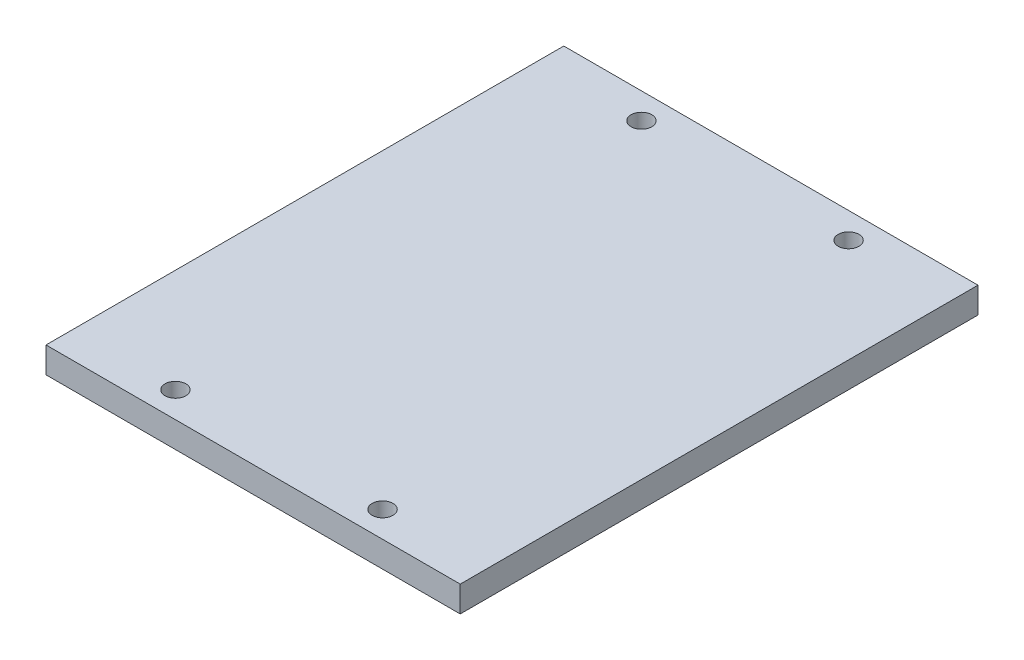
ISO-10303-21;
HEADER;
FILE_DESCRIPTION(('STEP AP214'),'2;1');
FILE_NAME('part.step','',(''),(''),'','','');
FILE_SCHEMA(('AUTOMOTIVE_DESIGN { 1 0 10303 214 1 1 1 1 }'));
ENDSEC;
DATA;
#1=APPLICATION_CONTEXT('core data for automotive mechanical design processes');
#2=APPLICATION_PROTOCOL_DEFINITION('international standard','automotive_design',2000,#1);
#3=PRODUCT_CONTEXT('',#1,'mechanical');
#4=PRODUCT('Part','Part','',(#3));
#5=PRODUCT_RELATED_PRODUCT_CATEGORY('part','',(#4));
#6=PRODUCT_DEFINITION_FORMATION('','',#4);
#7=PRODUCT_DEFINITION_CONTEXT('part definition',#1,'design');
#8=PRODUCT_DEFINITION('design','',#6,#7);
#9=PRODUCT_DEFINITION_SHAPE('','',#8);
#10=(LENGTH_UNIT() NAMED_UNIT(*) SI_UNIT(.MILLI.,.METRE.));
#11=(NAMED_UNIT(*) PLANE_ANGLE_UNIT() SI_UNIT($,.RADIAN.));
#12=(NAMED_UNIT(*) SI_UNIT($,.STERADIAN.) SOLID_ANGLE_UNIT());
#13=UNCERTAINTY_MEASURE_WITH_UNIT(LENGTH_MEASURE(1.E-05),#10,'distance_accuracy_value','');
#14=(GEOMETRIC_REPRESENTATION_CONTEXT(3) GLOBAL_UNCERTAINTY_ASSIGNED_CONTEXT((#13)) GLOBAL_UNIT_ASSIGNED_CONTEXT((#10,
#11,#12)) REPRESENTATION_CONTEXT('',''));
#15=CARTESIAN_POINT('',(0.,0.,0.));
#16=DIRECTION('',(0.,0.,1.));
#17=DIRECTION('',(1.,0.,0.));
#18=AXIS2_PLACEMENT_3D('',#15,#16,#17);
#19=CARTESIAN_POINT('',(50.8,6.35,63.5));
#20=DIRECTION('',(-1.,0.,0.));
#21=DIRECTION('',(0.,0.,1.));
#22=AXIS2_PLACEMENT_3D('',#19,#20,#21);
#23=PLANE('',#22);
#24=DIRECTION('',(0.,0.,-1.));
#25=VECTOR('',#24,1.);
#26=CARTESIAN_POINT('',(50.8,0.,63.5));
#27=LINE('',#26,#25);
#28=CARTESIAN_POINT('',(50.8,0.,63.5));
#29=VERTEX_POINT('',#28);
#30=CARTESIAN_POINT('',(50.8,0.,-63.5));
#31=VERTEX_POINT('',#30);
#32=EDGE_CURVE('E107',#29,#31,#27,.T.);
#33=ORIENTED_EDGE('',*,*,#32,.T.);
#34=DIRECTION('',(0.,-1.,0.));
#35=VECTOR('',#34,1.);
#36=CARTESIAN_POINT('',(50.8,6.35,-63.5));
#37=LINE('',#36,#35);
#38=CARTESIAN_POINT('',(50.8,6.35,-63.5));
#39=VERTEX_POINT('',#38);
#40=EDGE_CURVE('E11',#39,#31,#37,.T.);
#41=ORIENTED_EDGE('',*,*,#40,.F.);
#42=DIRECTION('',(0.,0.,-1.));
#43=VECTOR('',#42,1.);
#44=CARTESIAN_POINT('',(50.8,6.35,63.5));
#45=LINE('',#44,#43);
#46=CARTESIAN_POINT('',(50.8,6.35,63.5));
#47=VERTEX_POINT('',#46);
#48=EDGE_CURVE('E94',#47,#39,#45,.T.);
#49=ORIENTED_EDGE('',*,*,#48,.F.);
#50=DIRECTION('',(0.,-1.,0.));
#51=VECTOR('',#50,1.);
#52=CARTESIAN_POINT('',(50.8,6.35,63.5));
#53=LINE('',#52,#51);
#54=EDGE_CURVE('E103',#47,#29,#53,.T.);
#55=ORIENTED_EDGE('',*,*,#54,.T.);
#56=EDGE_LOOP('',(#33,#41,#49,#55));
#57=FACE_BOUND('',#56,.T.);
#58=ADVANCED_FACE('F41',(#57),#23,.F.);
#59=CARTESIAN_POINT('',(-50.8,6.35,-63.5));
#60=DIRECTION('',(0.,0.,1.));
#61=DIRECTION('',(1.,0.,0.));
#62=AXIS2_PLACEMENT_3D('',#59,#60,#61);
#63=PLANE('',#62);
#64=DIRECTION('',(-1.,0.,0.));
#65=VECTOR('',#64,1.);
#66=CARTESIAN_POINT('',(-50.8,0.,-63.5));
#67=LINE('',#66,#65);
#68=CARTESIAN_POINT('',(-50.8,0.,-63.5));
#69=VERTEX_POINT('',#68);
#70=EDGE_CURVE('E98',#31,#69,#67,.T.);
#71=ORIENTED_EDGE('',*,*,#70,.T.);
#72=DIRECTION('',(0.,-1.,0.));
#73=VECTOR('',#72,1.);
#74=CARTESIAN_POINT('',(-50.8,6.35,-63.5));
#75=LINE('',#74,#73);
#76=CARTESIAN_POINT('',(-50.8,6.35,-63.5));
#77=VERTEX_POINT('',#76);
#78=EDGE_CURVE('E50',#77,#69,#75,.T.);
#79=ORIENTED_EDGE('',*,*,#78,.F.);
#80=DIRECTION('',(-1.,0.,0.));
#81=VECTOR('',#80,1.);
#82=CARTESIAN_POINT('',(-50.8,6.35,-63.5));
#83=LINE('',#82,#81);
#84=EDGE_CURVE('E89',#39,#77,#83,.T.);
#85=ORIENTED_EDGE('',*,*,#84,.F.);
#86=ORIENTED_EDGE('',*,*,#40,.T.);
#87=EDGE_LOOP('',(#71,#79,#85,#86));
#88=FACE_BOUND('',#87,.T.);
#89=ADVANCED_FACE('F97',(#88),#63,.F.);
#90=CARTESIAN_POINT('',(-50.8,6.35,63.5));
#91=DIRECTION('',(1.,0.,0.));
#92=DIRECTION('',(0.,0.,-1.));
#93=AXIS2_PLACEMENT_3D('',#90,#91,#92);
#94=PLANE('',#93);
#95=DIRECTION('',(0.,0.,1.));
#96=VECTOR('',#95,1.);
#97=CARTESIAN_POINT('',(-50.8,0.,63.5));
#98=LINE('',#97,#96);
#99=CARTESIAN_POINT('',(-50.8,0.,63.5));
#100=VERTEX_POINT('',#99);
#101=EDGE_CURVE('E76',#69,#100,#98,.T.);
#102=ORIENTED_EDGE('',*,*,#101,.T.);
#103=DIRECTION('',(0.,-1.,0.));
#104=VECTOR('',#103,1.);
#105=CARTESIAN_POINT('',(-50.8,6.35,63.5));
#106=LINE('',#105,#104);
#107=CARTESIAN_POINT('',(-50.8,6.35,63.5));
#108=VERTEX_POINT('',#107);
#109=EDGE_CURVE('E99',#108,#100,#106,.T.);
#110=ORIENTED_EDGE('',*,*,#109,.F.);
#111=DIRECTION('',(0.,0.,1.));
#112=VECTOR('',#111,1.);
#113=CARTESIAN_POINT('',(-50.8,6.35,63.5));
#114=LINE('',#113,#112);
#115=EDGE_CURVE('E92',#77,#108,#114,.T.);
#116=ORIENTED_EDGE('',*,*,#115,.F.);
#117=ORIENTED_EDGE('',*,*,#78,.T.);
#118=EDGE_LOOP('',(#102,#110,#116,#117));
#119=FACE_BOUND('',#118,.T.);
#120=ADVANCED_FACE('F101',(#119),#94,.F.);
#121=CARTESIAN_POINT('',(-50.8,6.35,63.5));
#122=DIRECTION('',(0.,0.,-1.));
#123=DIRECTION('',(-1.,0.,0.));
#124=AXIS2_PLACEMENT_3D('',#121,#122,#123);
#125=PLANE('',#124);
#126=DIRECTION('',(1.,0.,0.));
#127=VECTOR('',#126,1.);
#128=CARTESIAN_POINT('',(-50.8,0.,63.5));
#129=LINE('',#128,#127);
#130=EDGE_CURVE('E82',#100,#29,#129,.T.);
#131=ORIENTED_EDGE('',*,*,#130,.T.);
#132=ORIENTED_EDGE('',*,*,#54,.F.);
#133=DIRECTION('',(1.,0.,0.));
#134=VECTOR('',#133,1.);
#135=CARTESIAN_POINT('',(-50.8,6.35,63.5));
#136=LINE('',#135,#134);
#137=EDGE_CURVE('E59',#108,#47,#136,.T.);
#138=ORIENTED_EDGE('',*,*,#137,.F.);
#139=ORIENTED_EDGE('',*,*,#109,.T.);
#140=EDGE_LOOP('',(#131,#132,#138,#139));
#141=FACE_BOUND('',#140,.T.);
#142=ADVANCED_FACE('F143',(#141),#125,.F.);
#143=CARTESIAN_POINT('',(0.,6.35,0.));
#144=DIRECTION('',(0.,-1.,0.));
#145=DIRECTION('',(0.,0.,-1.));
#146=AXIS2_PLACEMENT_3D('',#143,#144,#145);
#147=PLANE('',#146);
#148=CARTESIAN_POINT('',(25.4000000000001,6.35,-57.15));
#149=DIRECTION('',(0.,1.,0.));
#150=DIRECTION('',(0.,0.,-1.));
#151=AXIS2_PLACEMENT_3D('',#148,#149,#150);
#152=CIRCLE('',#151,2.55269999999999);
#153=CARTESIAN_POINT('',(25.4000000000001,6.35,-54.5973));
#154=VERTEX_POINT('',#153);
#155=EDGE_CURVE('E251',#154,#154,#152,.T.);
#156=ORIENTED_EDGE('',*,*,#155,.F.);
#157=EDGE_LOOP('',(#156));
#158=FACE_BOUND('',#157,.T.);
#159=CARTESIAN_POINT('',(25.4000000000001,6.35,57.15));
#160=DIRECTION('',(0.,1.,0.));
#161=DIRECTION('',(0.,0.,1.));
#162=AXIS2_PLACEMENT_3D('',#159,#160,#161);
#163=CIRCLE('',#162,2.55269999999999);
#164=CARTESIAN_POINT('',(25.4000000000001,6.35,59.7027));
#165=VERTEX_POINT('',#164);
#166=EDGE_CURVE('E248',#165,#165,#163,.T.);
#167=ORIENTED_EDGE('',*,*,#166,.F.);
#168=EDGE_LOOP('',(#167));
#169=FACE_BOUND('',#168,.T.);
#170=CARTESIAN_POINT('',(-25.4000000000001,6.35,57.15));
#171=DIRECTION('',(0.,1.,0.));
#172=DIRECTION('',(0.,0.,-1.));
#173=AXIS2_PLACEMENT_3D('',#170,#171,#172);
#174=CIRCLE('',#173,2.55269999999999);
#175=CARTESIAN_POINT('',(-25.4000000000001,6.35,59.7027));
#176=VERTEX_POINT('',#175);
#177=EDGE_CURVE('E250',#176,#176,#174,.T.);
#178=ORIENTED_EDGE('',*,*,#177,.F.);
#179=EDGE_LOOP('',(#178));
#180=FACE_BOUND('',#179,.T.);
#181=CARTESIAN_POINT('',(-25.4000000000001,6.35,-57.15));
#182=DIRECTION('',(0.,1.,0.));
#183=DIRECTION('',(0.,0.,1.));
#184=AXIS2_PLACEMENT_3D('',#181,#182,#183);
#185=CIRCLE('',#184,2.55269999999999);
#186=CARTESIAN_POINT('',(-25.4000000000001,6.35,-54.5973));
#187=VERTEX_POINT('',#186);
#188=EDGE_CURVE('E119',#187,#187,#185,.T.);
#189=ORIENTED_EDGE('',*,*,#188,.F.);
#190=EDGE_LOOP('',(#189));
#191=FACE_BOUND('',#190,.T.);
#192=ORIENTED_EDGE('',*,*,#48,.T.);
#193=ORIENTED_EDGE('',*,*,#84,.T.);
#194=ORIENTED_EDGE('',*,*,#115,.T.);
#195=ORIENTED_EDGE('',*,*,#137,.T.);
#196=EDGE_LOOP('',(#192,#193,#194,#195));
#197=FACE_BOUND('',#196,.T.);
#198=ADVANCED_FACE('F90',(#158,#169,#180,#191,#197),#147,.F.);
#199=CARTESIAN_POINT('',(0.,0.,0.));
#200=DIRECTION('',(0.,-1.,0.));
#201=DIRECTION('',(0.,0.,-1.));
#202=AXIS2_PLACEMENT_3D('',#199,#200,#201);
#203=PLANE('',#202);
#204=CARTESIAN_POINT('',(25.4000000000001,0.,-57.15));
#205=DIRECTION('',(0.,-1.,0.));
#206=DIRECTION('',(0.,0.,-1.));
#207=AXIS2_PLACEMENT_3D('',#204,#205,#206);
#208=CIRCLE('',#207,2.55269999999999);
#209=CARTESIAN_POINT('',(25.4000000000001,0.,-54.5973));
#210=VERTEX_POINT('',#209);
#211=EDGE_CURVE('E44',#210,#210,#208,.T.);
#212=ORIENTED_EDGE('',*,*,#211,.F.);
#213=EDGE_LOOP('',(#212));
#214=FACE_BOUND('',#213,.T.);
#215=CARTESIAN_POINT('',(25.4000000000001,0.,57.15));
#216=DIRECTION('',(0.,-1.,0.));
#217=DIRECTION('',(0.,0.,-1.));
#218=AXIS2_PLACEMENT_3D('',#215,#216,#217);
#219=CIRCLE('',#218,2.55269999999999);
#220=CARTESIAN_POINT('',(25.4000000000001,0.,59.7027));
#221=VERTEX_POINT('',#220);
#222=EDGE_CURVE('E121',#221,#221,#219,.T.);
#223=ORIENTED_EDGE('',*,*,#222,.F.);
#224=EDGE_LOOP('',(#223));
#225=FACE_BOUND('',#224,.T.);
#226=CARTESIAN_POINT('',(-25.4000000000001,0.,57.15));
#227=DIRECTION('',(0.,-1.,0.));
#228=DIRECTION('',(0.,0.,-1.));
#229=AXIS2_PLACEMENT_3D('',#226,#227,#228);
#230=CIRCLE('',#229,2.55269999999999);
#231=CARTESIAN_POINT('',(-25.4000000000001,0.,59.7027));
#232=VERTEX_POINT('',#231);
#233=EDGE_CURVE('E118',#232,#232,#230,.T.);
#234=ORIENTED_EDGE('',*,*,#233,.F.);
#235=EDGE_LOOP('',(#234));
#236=FACE_BOUND('',#235,.T.);
#237=CARTESIAN_POINT('',(-25.4000000000001,0.,-57.15));
#238=DIRECTION('',(0.,-1.,0.));
#239=DIRECTION('',(0.,0.,-1.));
#240=AXIS2_PLACEMENT_3D('',#237,#238,#239);
#241=CIRCLE('',#240,2.55269999999999);
#242=CARTESIAN_POINT('',(-25.4000000000001,0.,-54.5973));
#243=VERTEX_POINT('',#242);
#244=EDGE_CURVE('E115',#243,#243,#241,.T.);
#245=ORIENTED_EDGE('',*,*,#244,.F.);
#246=EDGE_LOOP('',(#245));
#247=FACE_BOUND('',#246,.T.);
#248=ORIENTED_EDGE('',*,*,#32,.F.);
#249=ORIENTED_EDGE('',*,*,#130,.F.);
#250=ORIENTED_EDGE('',*,*,#101,.F.);
#251=ORIENTED_EDGE('',*,*,#70,.F.);
#252=EDGE_LOOP('',(#248,#249,#250,#251));
#253=FACE_BOUND('',#252,.T.);
#254=ADVANCED_FACE('F131',(#214,#225,#236,#247,#253),#203,.T.);
#255=CARTESIAN_POINT('',(-25.4000000000001,-3.175,-57.15));
#256=DIRECTION('',(0.,1.,0.));
#257=DIRECTION('',(0.,0.,1.));
#258=AXIS2_PLACEMENT_3D('',#255,#256,#257);
#259=CYLINDRICAL_SURFACE('',#258,2.55269999999999);
#260=CARTESIAN_POINT('',(-25.4000000000001,0.,-54.5973));
#261=CARTESIAN_POINT('',(-25.4000000000001,0.0661458333333336,-54.5973));
#262=CARTESIAN_POINT('',(-25.4000000000001,0.132291666666667,-54.5973));
#263=CARTESIAN_POINT('',(-25.4000000000001,0.264583333333334,-54.5973));
#264=CARTESIAN_POINT('',(-25.4000000000001,0.330729166666667,-54.5973));
#265=CARTESIAN_POINT('',(-25.4000000000001,0.463020833333334,-54.5973));
#266=CARTESIAN_POINT('',(-25.4000000000001,0.529166666666667,-54.5973));
#267=CARTESIAN_POINT('',(-25.4000000000001,0.661458333333334,-54.5973));
#268=CARTESIAN_POINT('',(-25.4000000000001,0.727604166666667,-54.5973));
#269=CARTESIAN_POINT('',(-25.4000000000001,0.859895833333333,-54.5973));
#270=CARTESIAN_POINT('',(-25.4000000000001,0.926041666666667,-54.5973));
#271=CARTESIAN_POINT('',(-25.4000000000001,1.05833333333333,-54.5973));
#272=CARTESIAN_POINT('',(-25.4000000000001,1.12447916666667,-54.5973));
#273=CARTESIAN_POINT('',(-25.4000000000001,1.25677083333333,-54.5973));
#274=CARTESIAN_POINT('',(-25.4000000000001,1.32291666666667,-54.5973));
#275=CARTESIAN_POINT('',(-25.4000000000001,1.45520833333333,-54.5973));
#276=CARTESIAN_POINT('',(-25.4000000000001,1.52135416666667,-54.5973));
#277=CARTESIAN_POINT('',(-25.4000000000001,1.65364583333333,-54.5973));
#278=CARTESIAN_POINT('',(-25.4000000000001,1.71979166666667,-54.5973));
#279=CARTESIAN_POINT('',(-25.4000000000001,1.85208333333333,-54.5973));
#280=CARTESIAN_POINT('',(-25.4000000000001,1.91822916666667,-54.5973));
#281=CARTESIAN_POINT('',(-25.4000000000001,2.05052083333333,-54.5973));
#282=CARTESIAN_POINT('',(-25.4000000000001,2.11666666666667,-54.5973));
#283=CARTESIAN_POINT('',(-25.4000000000001,2.24895833333333,-54.5973));
#284=CARTESIAN_POINT('',(-25.4000000000001,2.31510416666667,-54.5973));
#285=CARTESIAN_POINT('',(-25.4000000000001,2.44739583333333,-54.5973));
#286=CARTESIAN_POINT('',(-25.4000000000001,2.51354166666667,-54.5973));
#287=CARTESIAN_POINT('',(-25.4000000000001,2.64583333333333,-54.5973));
#288=CARTESIAN_POINT('',(-25.4000000000001,2.71197916666667,-54.5973));
#289=CARTESIAN_POINT('',(-25.4000000000001,2.84427083333333,-54.5973));
#290=CARTESIAN_POINT('',(-25.4000000000001,2.91041666666667,-54.5973));
#291=CARTESIAN_POINT('',(-25.4000000000001,3.04270833333333,-54.5973));
#292=CARTESIAN_POINT('',(-25.4000000000001,3.10885416666667,-54.5973));
#293=CARTESIAN_POINT('',(-25.4000000000001,3.24114583333333,-54.5973));
#294=CARTESIAN_POINT('',(-25.4000000000001,3.30729166666667,-54.5973));
#295=CARTESIAN_POINT('',(-25.4000000000001,3.43958333333333,-54.5973));
#296=CARTESIAN_POINT('',(-25.4000000000001,3.50572916666667,-54.5973));
#297=CARTESIAN_POINT('',(-25.4000000000001,3.63802083333333,-54.5973));
#298=CARTESIAN_POINT('',(-25.4000000000001,3.70416666666667,-54.5973));
#299=CARTESIAN_POINT('',(-25.4000000000001,3.83645833333333,-54.5973));
#300=CARTESIAN_POINT('',(-25.4000000000001,3.90260416666667,-54.5973));
#301=CARTESIAN_POINT('',(-25.4000000000001,4.03489583333333,-54.5973));
#302=CARTESIAN_POINT('',(-25.4000000000001,4.10104166666667,-54.5973));
#303=CARTESIAN_POINT('',(-25.4000000000001,4.23333333333333,-54.5973));
#304=CARTESIAN_POINT('',(-25.4000000000001,4.29947916666667,-54.5973));
#305=CARTESIAN_POINT('',(-25.4000000000001,4.43177083333333,-54.5973));
#306=CARTESIAN_POINT('',(-25.4000000000001,4.49791666666667,-54.5973));
#307=CARTESIAN_POINT('',(-25.4000000000001,4.63020833333333,-54.5973));
#308=CARTESIAN_POINT('',(-25.4000000000001,4.69635416666667,-54.5973));
#309=CARTESIAN_POINT('',(-25.4000000000001,4.82864583333333,-54.5973));
#310=CARTESIAN_POINT('',(-25.4000000000001,4.89479166666667,-54.5973));
#311=CARTESIAN_POINT('',(-25.4000000000001,5.02708333333333,-54.5973));
#312=CARTESIAN_POINT('',(-25.4000000000001,5.09322916666667,-54.5973));
#313=CARTESIAN_POINT('',(-25.4000000000001,5.22552083333333,-54.5973));
#314=CARTESIAN_POINT('',(-25.4000000000001,5.29166666666667,-54.5973));
#315=CARTESIAN_POINT('',(-25.4000000000001,5.42395833333333,-54.5973));
#316=CARTESIAN_POINT('',(-25.4000000000001,5.49010416666667,-54.5973));
#317=CARTESIAN_POINT('',(-25.4000000000001,5.62239583333333,-54.5973));
#318=CARTESIAN_POINT('',(-25.4000000000001,5.68854166666667,-54.5973));
#319=CARTESIAN_POINT('',(-25.4000000000001,5.82083333333333,-54.5973));
#320=CARTESIAN_POINT('',(-25.4000000000001,5.88697916666667,-54.5973));
#321=CARTESIAN_POINT('',(-25.4000000000001,6.01927083333333,-54.5973));
#322=CARTESIAN_POINT('',(-25.4000000000001,6.08541666666667,-54.5973));
#323=CARTESIAN_POINT('',(-25.4000000000001,6.21770833333333,-54.5973));
#324=CARTESIAN_POINT('',(-25.4000000000001,6.28385416666667,-54.5973));
#325=CARTESIAN_POINT('',(-25.4000000000001,6.35,-54.5973));
#326=B_SPLINE_CURVE_WITH_KNOTS('',3,(#260,#261,#262,#263,#264,#265,#266,#267,#268,#269,#270,
#271,#272,#273,#274,#275,#276,#277,#278,#279,#280,#281,#282,#283,#284,#285,#286,#287,#288,#289,
#290,#291,#292,#293,#294,#295,#296,#297,#298,#299,#300,#301,#302,#303,#304,#305,#306,#307,#308,
#309,#310,#311,#312,#313,#314,#315,#316,#317,#318,#319,#320,#321,#322,#323,#324,#325),
.UNSPECIFIED.,.F.,.F.,(4,2,2,2,2,2,2,2,2,2,2,2,2,2,2,2,2,2,2,2,2,2,2,2,2,2,2,2,2,2,2,2,4),(0.,
0.1984375,0.396875,0.5953125,0.79375,0.9921875,1.190625,1.3890625,1.5875,1.7859375,1.984375,
2.1828125,2.38125,2.5796875,2.778125,2.9765625,3.175,3.3734375,3.571875,3.7703125,3.96875,
4.1671875,4.365625,4.5640625,4.7625,4.9609375,5.159375,5.3578125,5.55625,5.7546875,5.953125,
6.1515625,6.35),.UNSPECIFIED.);
#327=EDGE_CURVE('BSEAM134',#243,#187,#326,.T.);
#328=ORIENTED_EDGE('',*,*,#244,.T.);
#329=ORIENTED_EDGE('',*,*,#188,.T.);
#330=ORIENTED_EDGE('',*,*,#327,.T.);
#331=ORIENTED_EDGE('',*,*,#327,.F.);
#332=EDGE_LOOP('',(#328,#330,#329,#331));
#333=FACE_BOUND('',#332,.T.);
#334=ADVANCED_FACE('F134',(#333),#259,.F.);
#335=CARTESIAN_POINT('',(-25.4000000000001,-3.175,57.15));
#336=DIRECTION('',(0.,1.,0.));
#337=DIRECTION('',(0.,0.,1.));
#338=AXIS2_PLACEMENT_3D('',#335,#336,#337);
#339=CYLINDRICAL_SURFACE('',#338,2.55269999999999);
#340=CARTESIAN_POINT('',(-25.4000000000001,0.,59.7027));
#341=CARTESIAN_POINT('',(-25.4000000000001,0.0661458333333336,59.7027));
#342=CARTESIAN_POINT('',(-25.4000000000001,0.132291666666667,59.7027));
#343=CARTESIAN_POINT('',(-25.4000000000001,0.264583333333334,59.7027));
#344=CARTESIAN_POINT('',(-25.4000000000001,0.330729166666667,59.7027));
#345=CARTESIAN_POINT('',(-25.4000000000001,0.463020833333334,59.7027));
#346=CARTESIAN_POINT('',(-25.4000000000001,0.529166666666667,59.7027));
#347=CARTESIAN_POINT('',(-25.4000000000001,0.661458333333334,59.7027));
#348=CARTESIAN_POINT('',(-25.4000000000001,0.727604166666667,59.7027));
#349=CARTESIAN_POINT('',(-25.4000000000001,0.859895833333333,59.7027));
#350=CARTESIAN_POINT('',(-25.4000000000001,0.926041666666667,59.7027));
#351=CARTESIAN_POINT('',(-25.4000000000001,1.05833333333333,59.7027));
#352=CARTESIAN_POINT('',(-25.4000000000001,1.12447916666667,59.7027));
#353=CARTESIAN_POINT('',(-25.4000000000001,1.25677083333333,59.7027));
#354=CARTESIAN_POINT('',(-25.4000000000001,1.32291666666667,59.7027));
#355=CARTESIAN_POINT('',(-25.4000000000001,1.45520833333333,59.7027));
#356=CARTESIAN_POINT('',(-25.4000000000001,1.52135416666667,59.7027));
#357=CARTESIAN_POINT('',(-25.4000000000001,1.65364583333333,59.7027));
#358=CARTESIAN_POINT('',(-25.4000000000001,1.71979166666667,59.7027));
#359=CARTESIAN_POINT('',(-25.4000000000001,1.85208333333333,59.7027));
#360=CARTESIAN_POINT('',(-25.4000000000001,1.91822916666667,59.7027));
#361=CARTESIAN_POINT('',(-25.4000000000001,2.05052083333333,59.7027));
#362=CARTESIAN_POINT('',(-25.4000000000001,2.11666666666667,59.7027));
#363=CARTESIAN_POINT('',(-25.4000000000001,2.24895833333333,59.7027));
#364=CARTESIAN_POINT('',(-25.4000000000001,2.31510416666667,59.7027));
#365=CARTESIAN_POINT('',(-25.4000000000001,2.44739583333333,59.7027));
#366=CARTESIAN_POINT('',(-25.4000000000001,2.51354166666667,59.7027));
#367=CARTESIAN_POINT('',(-25.4000000000001,2.64583333333333,59.7027));
#368=CARTESIAN_POINT('',(-25.4000000000001,2.71197916666667,59.7027));
#369=CARTESIAN_POINT('',(-25.4000000000001,2.84427083333333,59.7027));
#370=CARTESIAN_POINT('',(-25.4000000000001,2.91041666666667,59.7027));
#371=CARTESIAN_POINT('',(-25.4000000000001,3.04270833333333,59.7027));
#372=CARTESIAN_POINT('',(-25.4000000000001,3.10885416666667,59.7027));
#373=CARTESIAN_POINT('',(-25.4000000000001,3.24114583333333,59.7027));
#374=CARTESIAN_POINT('',(-25.4000000000001,3.30729166666667,59.7027));
#375=CARTESIAN_POINT('',(-25.4000000000001,3.43958333333333,59.7027));
#376=CARTESIAN_POINT('',(-25.4000000000001,3.50572916666667,59.7027));
#377=CARTESIAN_POINT('',(-25.4000000000001,3.63802083333333,59.7027));
#378=CARTESIAN_POINT('',(-25.4000000000001,3.70416666666667,59.7027));
#379=CARTESIAN_POINT('',(-25.4000000000001,3.83645833333333,59.7027));
#380=CARTESIAN_POINT('',(-25.4000000000001,3.90260416666667,59.7027));
#381=CARTESIAN_POINT('',(-25.4000000000001,4.03489583333333,59.7027));
#382=CARTESIAN_POINT('',(-25.4000000000001,4.10104166666667,59.7027));
#383=CARTESIAN_POINT('',(-25.4000000000001,4.23333333333333,59.7027));
#384=CARTESIAN_POINT('',(-25.4000000000001,4.29947916666667,59.7027));
#385=CARTESIAN_POINT('',(-25.4000000000001,4.43177083333333,59.7027));
#386=CARTESIAN_POINT('',(-25.4000000000001,4.49791666666667,59.7027));
#387=CARTESIAN_POINT('',(-25.4000000000001,4.63020833333333,59.7027));
#388=CARTESIAN_POINT('',(-25.4000000000001,4.69635416666667,59.7027));
#389=CARTESIAN_POINT('',(-25.4000000000001,4.82864583333333,59.7027));
#390=CARTESIAN_POINT('',(-25.4000000000001,4.89479166666667,59.7027));
#391=CARTESIAN_POINT('',(-25.4000000000001,5.02708333333333,59.7027));
#392=CARTESIAN_POINT('',(-25.4000000000001,5.09322916666667,59.7027));
#393=CARTESIAN_POINT('',(-25.4000000000001,5.22552083333333,59.7027));
#394=CARTESIAN_POINT('',(-25.4000000000001,5.29166666666667,59.7027));
#395=CARTESIAN_POINT('',(-25.4000000000001,5.42395833333333,59.7027));
#396=CARTESIAN_POINT('',(-25.4000000000001,5.49010416666667,59.7027));
#397=CARTESIAN_POINT('',(-25.4000000000001,5.62239583333333,59.7027));
#398=CARTESIAN_POINT('',(-25.4000000000001,5.68854166666667,59.7027));
#399=CARTESIAN_POINT('',(-25.4000000000001,5.82083333333333,59.7027));
#400=CARTESIAN_POINT('',(-25.4000000000001,5.88697916666667,59.7027));
#401=CARTESIAN_POINT('',(-25.4000000000001,6.01927083333333,59.7027));
#402=CARTESIAN_POINT('',(-25.4000000000001,6.08541666666667,59.7027));
#403=CARTESIAN_POINT('',(-25.4000000000001,6.21770833333333,59.7027));
#404=CARTESIAN_POINT('',(-25.4000000000001,6.28385416666667,59.7027));
#405=CARTESIAN_POINT('',(-25.4000000000001,6.35,59.7027));
#406=B_SPLINE_CURVE_WITH_KNOTS('',3,(#340,#341,#342,#343,#344,#345,#346,#347,#348,#349,#350,
#351,#352,#353,#354,#355,#356,#357,#358,#359,#360,#361,#362,#363,#364,#365,#366,#367,#368,#369,
#370,#371,#372,#373,#374,#375,#376,#377,#378,#379,#380,#381,#382,#383,#384,#385,#386,#387,#388,
#389,#390,#391,#392,#393,#394,#395,#396,#397,#398,#399,#400,#401,#402,#403,#404,#405),
.UNSPECIFIED.,.F.,.F.,(4,2,2,2,2,2,2,2,2,2,2,2,2,2,2,2,2,2,2,2,2,2,2,2,2,2,2,2,2,2,2,2,4),(0.,
0.1984375,0.396875,0.5953125,0.79375,0.9921875,1.190625,1.3890625,1.5875,1.7859375,1.984375,
2.1828125,2.38125,2.5796875,2.778125,2.9765625,3.175,3.3734375,3.571875,3.7703125,3.96875,
4.1671875,4.365625,4.5640625,4.7625,4.9609375,5.159375,5.3578125,5.55625,5.7546875,5.953125,
6.1515625,6.35),.UNSPECIFIED.);
#407=EDGE_CURVE('BSEAM192',#232,#176,#406,.T.);
#408=ORIENTED_EDGE('',*,*,#233,.T.);
#409=ORIENTED_EDGE('',*,*,#177,.T.);
#410=ORIENTED_EDGE('',*,*,#407,.T.);
#411=ORIENTED_EDGE('',*,*,#407,.F.);
#412=EDGE_LOOP('',(#408,#410,#409,#411));
#413=FACE_BOUND('',#412,.T.);
#414=ADVANCED_FACE('F192',(#413),#339,.F.);
#415=CARTESIAN_POINT('',(25.4000000000001,-3.175,57.15));
#416=DIRECTION('',(0.,1.,0.));
#417=DIRECTION('',(0.,0.,1.));
#418=AXIS2_PLACEMENT_3D('',#415,#416,#417);
#419=CYLINDRICAL_SURFACE('',#418,2.55269999999999);
#420=CARTESIAN_POINT('',(25.4000000000001,0.,59.7027));
#421=CARTESIAN_POINT('',(25.4000000000001,0.0661458333333336,59.7027));
#422=CARTESIAN_POINT('',(25.4000000000001,0.132291666666667,59.7027));
#423=CARTESIAN_POINT('',(25.4000000000001,0.264583333333334,59.7027));
#424=CARTESIAN_POINT('',(25.4000000000001,0.330729166666667,59.7027));
#425=CARTESIAN_POINT('',(25.4000000000001,0.463020833333334,59.7027));
#426=CARTESIAN_POINT('',(25.4000000000001,0.529166666666667,59.7027));
#427=CARTESIAN_POINT('',(25.4000000000001,0.661458333333334,59.7027));
#428=CARTESIAN_POINT('',(25.4000000000001,0.727604166666667,59.7027));
#429=CARTESIAN_POINT('',(25.4000000000001,0.859895833333333,59.7027));
#430=CARTESIAN_POINT('',(25.4000000000001,0.926041666666667,59.7027));
#431=CARTESIAN_POINT('',(25.4000000000001,1.05833333333333,59.7027));
#432=CARTESIAN_POINT('',(25.4000000000001,1.12447916666667,59.7027));
#433=CARTESIAN_POINT('',(25.4000000000001,1.25677083333333,59.7027));
#434=CARTESIAN_POINT('',(25.4000000000001,1.32291666666667,59.7027));
#435=CARTESIAN_POINT('',(25.4000000000001,1.45520833333333,59.7027));
#436=CARTESIAN_POINT('',(25.4000000000001,1.52135416666667,59.7027));
#437=CARTESIAN_POINT('',(25.4000000000001,1.65364583333333,59.7027));
#438=CARTESIAN_POINT('',(25.4000000000001,1.71979166666667,59.7027));
#439=CARTESIAN_POINT('',(25.4000000000001,1.85208333333333,59.7027));
#440=CARTESIAN_POINT('',(25.4000000000001,1.91822916666667,59.7027));
#441=CARTESIAN_POINT('',(25.4000000000001,2.05052083333333,59.7027));
#442=CARTESIAN_POINT('',(25.4000000000001,2.11666666666667,59.7027));
#443=CARTESIAN_POINT('',(25.4000000000001,2.24895833333333,59.7027));
#444=CARTESIAN_POINT('',(25.4000000000001,2.31510416666667,59.7027));
#445=CARTESIAN_POINT('',(25.4000000000001,2.44739583333333,59.7027));
#446=CARTESIAN_POINT('',(25.4000000000001,2.51354166666667,59.7027));
#447=CARTESIAN_POINT('',(25.4000000000001,2.64583333333333,59.7027));
#448=CARTESIAN_POINT('',(25.4000000000001,2.71197916666667,59.7027));
#449=CARTESIAN_POINT('',(25.4000000000001,2.84427083333333,59.7027));
#450=CARTESIAN_POINT('',(25.4000000000001,2.91041666666667,59.7027));
#451=CARTESIAN_POINT('',(25.4000000000001,3.04270833333333,59.7027));
#452=CARTESIAN_POINT('',(25.4000000000001,3.10885416666667,59.7027));
#453=CARTESIAN_POINT('',(25.4000000000001,3.24114583333333,59.7027));
#454=CARTESIAN_POINT('',(25.4000000000001,3.30729166666667,59.7027));
#455=CARTESIAN_POINT('',(25.4000000000001,3.43958333333333,59.7027));
#456=CARTESIAN_POINT('',(25.4000000000001,3.50572916666667,59.7027));
#457=CARTESIAN_POINT('',(25.4000000000001,3.63802083333333,59.7027));
#458=CARTESIAN_POINT('',(25.4000000000001,3.70416666666667,59.7027));
#459=CARTESIAN_POINT('',(25.4000000000001,3.83645833333333,59.7027));
#460=CARTESIAN_POINT('',(25.4000000000001,3.90260416666667,59.7027));
#461=CARTESIAN_POINT('',(25.4000000000001,4.03489583333333,59.7027));
#462=CARTESIAN_POINT('',(25.4000000000001,4.10104166666667,59.7027));
#463=CARTESIAN_POINT('',(25.4000000000001,4.23333333333333,59.7027));
#464=CARTESIAN_POINT('',(25.4000000000001,4.29947916666667,59.7027));
#465=CARTESIAN_POINT('',(25.4000000000001,4.43177083333333,59.7027));
#466=CARTESIAN_POINT('',(25.4000000000001,4.49791666666667,59.7027));
#467=CARTESIAN_POINT('',(25.4000000000001,4.63020833333333,59.7027));
#468=CARTESIAN_POINT('',(25.4000000000001,4.69635416666667,59.7027));
#469=CARTESIAN_POINT('',(25.4000000000001,4.82864583333333,59.7027));
#470=CARTESIAN_POINT('',(25.4000000000001,4.89479166666667,59.7027));
#471=CARTESIAN_POINT('',(25.4000000000001,5.02708333333333,59.7027));
#472=CARTESIAN_POINT('',(25.4000000000001,5.09322916666667,59.7027));
#473=CARTESIAN_POINT('',(25.4000000000001,5.22552083333333,59.7027));
#474=CARTESIAN_POINT('',(25.4000000000001,5.29166666666667,59.7027));
#475=CARTESIAN_POINT('',(25.4000000000001,5.42395833333333,59.7027));
#476=CARTESIAN_POINT('',(25.4000000000001,5.49010416666667,59.7027));
#477=CARTESIAN_POINT('',(25.4000000000001,5.62239583333333,59.7027));
#478=CARTESIAN_POINT('',(25.4000000000001,5.68854166666667,59.7027));
#479=CARTESIAN_POINT('',(25.4000000000001,5.82083333333333,59.7027));
#480=CARTESIAN_POINT('',(25.4000000000001,5.88697916666667,59.7027));
#481=CARTESIAN_POINT('',(25.4000000000001,6.01927083333333,59.7027));
#482=CARTESIAN_POINT('',(25.4000000000001,6.08541666666667,59.7027));
#483=CARTESIAN_POINT('',(25.4000000000001,6.21770833333333,59.7027));
#484=CARTESIAN_POINT('',(25.4000000000001,6.28385416666667,59.7027));
#485=CARTESIAN_POINT('',(25.4000000000001,6.35,59.7027));
#486=B_SPLINE_CURVE_WITH_KNOTS('',3,(#420,#421,#422,#423,#424,#425,#426,#427,#428,#429,#430,
#431,#432,#433,#434,#435,#436,#437,#438,#439,#440,#441,#442,#443,#444,#445,#446,#447,#448,#449,
#450,#451,#452,#453,#454,#455,#456,#457,#458,#459,#460,#461,#462,#463,#464,#465,#466,#467,#468,
#469,#470,#471,#472,#473,#474,#475,#476,#477,#478,#479,#480,#481,#482,#483,#484,#485),
.UNSPECIFIED.,.F.,.F.,(4,2,2,2,2,2,2,2,2,2,2,2,2,2,2,2,2,2,2,2,2,2,2,2,2,2,2,2,2,2,2,2,4),(0.,
0.1984375,0.396875,0.5953125,0.79375,0.9921875,1.190625,1.3890625,1.5875,1.7859375,1.984375,
2.1828125,2.38125,2.5796875,2.778125,2.9765625,3.175,3.3734375,3.571875,3.7703125,3.96875,
4.1671875,4.365625,4.5640625,4.7625,4.9609375,5.159375,5.3578125,5.55625,5.7546875,5.953125,
6.1515625,6.35),.UNSPECIFIED.);
#487=EDGE_CURVE('BSEAM203',#221,#165,#486,.T.);
#488=ORIENTED_EDGE('',*,*,#222,.T.);
#489=ORIENTED_EDGE('',*,*,#166,.T.);
#490=ORIENTED_EDGE('',*,*,#487,.T.);
#491=ORIENTED_EDGE('',*,*,#487,.F.);
#492=EDGE_LOOP('',(#488,#490,#489,#491));
#493=FACE_BOUND('',#492,.T.);
#494=ADVANCED_FACE('F203',(#493),#419,.F.);
#495=CARTESIAN_POINT('',(25.4000000000001,-3.175,-57.15));
#496=DIRECTION('',(0.,1.,0.));
#497=DIRECTION('',(0.,0.,1.));
#498=AXIS2_PLACEMENT_3D('',#495,#496,#497);
#499=CYLINDRICAL_SURFACE('',#498,2.55269999999999);
#500=CARTESIAN_POINT('',(25.4000000000001,0.,-54.5973));
#501=CARTESIAN_POINT('',(25.4000000000001,0.0661458333333336,-54.5973));
#502=CARTESIAN_POINT('',(25.4000000000001,0.132291666666667,-54.5973));
#503=CARTESIAN_POINT('',(25.4000000000001,0.264583333333334,-54.5973));
#504=CARTESIAN_POINT('',(25.4000000000001,0.330729166666667,-54.5973));
#505=CARTESIAN_POINT('',(25.4000000000001,0.463020833333334,-54.5973));
#506=CARTESIAN_POINT('',(25.4000000000001,0.529166666666667,-54.5973));
#507=CARTESIAN_POINT('',(25.4000000000001,0.661458333333334,-54.5973));
#508=CARTESIAN_POINT('',(25.4000000000001,0.727604166666667,-54.5973));
#509=CARTESIAN_POINT('',(25.4000000000001,0.859895833333333,-54.5973));
#510=CARTESIAN_POINT('',(25.4000000000001,0.926041666666667,-54.5973));
#511=CARTESIAN_POINT('',(25.4000000000001,1.05833333333333,-54.5973));
#512=CARTESIAN_POINT('',(25.4000000000001,1.12447916666667,-54.5973));
#513=CARTESIAN_POINT('',(25.4000000000001,1.25677083333333,-54.5973));
#514=CARTESIAN_POINT('',(25.4000000000001,1.32291666666667,-54.5973));
#515=CARTESIAN_POINT('',(25.4000000000001,1.45520833333333,-54.5973));
#516=CARTESIAN_POINT('',(25.4000000000001,1.52135416666667,-54.5973));
#517=CARTESIAN_POINT('',(25.4000000000001,1.65364583333333,-54.5973));
#518=CARTESIAN_POINT('',(25.4000000000001,1.71979166666667,-54.5973));
#519=CARTESIAN_POINT('',(25.4000000000001,1.85208333333333,-54.5973));
#520=CARTESIAN_POINT('',(25.4000000000001,1.91822916666667,-54.5973));
#521=CARTESIAN_POINT('',(25.4000000000001,2.05052083333333,-54.5973));
#522=CARTESIAN_POINT('',(25.4000000000001,2.11666666666667,-54.5973));
#523=CARTESIAN_POINT('',(25.4000000000001,2.24895833333333,-54.5973));
#524=CARTESIAN_POINT('',(25.4000000000001,2.31510416666667,-54.5973));
#525=CARTESIAN_POINT('',(25.4000000000001,2.44739583333333,-54.5973));
#526=CARTESIAN_POINT('',(25.4000000000001,2.51354166666667,-54.5973));
#527=CARTESIAN_POINT('',(25.4000000000001,2.64583333333333,-54.5973));
#528=CARTESIAN_POINT('',(25.4000000000001,2.71197916666667,-54.5973));
#529=CARTESIAN_POINT('',(25.4000000000001,2.84427083333333,-54.5973));
#530=CARTESIAN_POINT('',(25.4000000000001,2.91041666666667,-54.5973));
#531=CARTESIAN_POINT('',(25.4000000000001,3.04270833333333,-54.5973));
#532=CARTESIAN_POINT('',(25.4000000000001,3.10885416666667,-54.5973));
#533=CARTESIAN_POINT('',(25.4000000000001,3.24114583333333,-54.5973));
#534=CARTESIAN_POINT('',(25.4000000000001,3.30729166666667,-54.5973));
#535=CARTESIAN_POINT('',(25.4000000000001,3.43958333333333,-54.5973));
#536=CARTESIAN_POINT('',(25.4000000000001,3.50572916666667,-54.5973));
#537=CARTESIAN_POINT('',(25.4000000000001,3.63802083333333,-54.5973));
#538=CARTESIAN_POINT('',(25.4000000000001,3.70416666666667,-54.5973));
#539=CARTESIAN_POINT('',(25.4000000000001,3.83645833333333,-54.5973));
#540=CARTESIAN_POINT('',(25.4000000000001,3.90260416666667,-54.5973));
#541=CARTESIAN_POINT('',(25.4000000000001,4.03489583333333,-54.5973));
#542=CARTESIAN_POINT('',(25.4000000000001,4.10104166666667,-54.5973));
#543=CARTESIAN_POINT('',(25.4000000000001,4.23333333333333,-54.5973));
#544=CARTESIAN_POINT('',(25.4000000000001,4.29947916666667,-54.5973));
#545=CARTESIAN_POINT('',(25.4000000000001,4.43177083333333,-54.5973));
#546=CARTESIAN_POINT('',(25.4000000000001,4.49791666666667,-54.5973));
#547=CARTESIAN_POINT('',(25.4000000000001,4.63020833333333,-54.5973));
#548=CARTESIAN_POINT('',(25.4000000000001,4.69635416666667,-54.5973));
#549=CARTESIAN_POINT('',(25.4000000000001,4.82864583333333,-54.5973));
#550=CARTESIAN_POINT('',(25.4000000000001,4.89479166666667,-54.5973));
#551=CARTESIAN_POINT('',(25.4000000000001,5.02708333333333,-54.5973));
#552=CARTESIAN_POINT('',(25.4000000000001,5.09322916666667,-54.5973));
#553=CARTESIAN_POINT('',(25.4000000000001,5.22552083333333,-54.5973));
#554=CARTESIAN_POINT('',(25.4000000000001,5.29166666666667,-54.5973));
#555=CARTESIAN_POINT('',(25.4000000000001,5.42395833333333,-54.5973));
#556=CARTESIAN_POINT('',(25.4000000000001,5.49010416666667,-54.5973));
#557=CARTESIAN_POINT('',(25.4000000000001,5.62239583333333,-54.5973));
#558=CARTESIAN_POINT('',(25.4000000000001,5.68854166666667,-54.5973));
#559=CARTESIAN_POINT('',(25.4000000000001,5.82083333333333,-54.5973));
#560=CARTESIAN_POINT('',(25.4000000000001,5.88697916666667,-54.5973));
#561=CARTESIAN_POINT('',(25.4000000000001,6.01927083333333,-54.5973));
#562=CARTESIAN_POINT('',(25.4000000000001,6.08541666666667,-54.5973));
#563=CARTESIAN_POINT('',(25.4000000000001,6.21770833333333,-54.5973));
#564=CARTESIAN_POINT('',(25.4000000000001,6.28385416666667,-54.5973));
#565=CARTESIAN_POINT('',(25.4000000000001,6.35,-54.5973));
#566=B_SPLINE_CURVE_WITH_KNOTS('',3,(#500,#501,#502,#503,#504,#505,#506,#507,#508,#509,#510,
#511,#512,#513,#514,#515,#516,#517,#518,#519,#520,#521,#522,#523,#524,#525,#526,#527,#528,#529,
#530,#531,#532,#533,#534,#535,#536,#537,#538,#539,#540,#541,#542,#543,#544,#545,#546,#547,#548,
#549,#550,#551,#552,#553,#554,#555,#556,#557,#558,#559,#560,#561,#562,#563,#564,#565),
.UNSPECIFIED.,.F.,.F.,(4,2,2,2,2,2,2,2,2,2,2,2,2,2,2,2,2,2,2,2,2,2,2,2,2,2,2,2,2,2,2,2,4),(0.,
0.1984375,0.396875,0.5953125,0.79375,0.9921875,1.190625,1.3890625,1.5875,1.7859375,1.984375,
2.1828125,2.38125,2.5796875,2.778125,2.9765625,3.175,3.3734375,3.571875,3.7703125,3.96875,
4.1671875,4.365625,4.5640625,4.7625,4.9609375,5.159375,5.3578125,5.55625,5.7546875,5.953125,
6.1515625,6.35),.UNSPECIFIED.);
#567=EDGE_CURVE('BSEAM128',#210,#154,#566,.T.);
#568=ORIENTED_EDGE('',*,*,#211,.T.);
#569=ORIENTED_EDGE('',*,*,#155,.T.);
#570=ORIENTED_EDGE('',*,*,#567,.T.);
#571=ORIENTED_EDGE('',*,*,#567,.F.);
#572=EDGE_LOOP('',(#568,#570,#569,#571));
#573=FACE_BOUND('',#572,.T.);
#574=ADVANCED_FACE('F128',(#573),#499,.F.);
#575=CLOSED_SHELL('',(#58,#89,#120,#142,#198,#254,#334,#414,#494,#574));
#576=MANIFOLD_SOLID_BREP('B2',#575);
#577=ADVANCED_BREP_SHAPE_REPRESENTATION('',(#18,#576),#14);
#578=SHAPE_DEFINITION_REPRESENTATION(#9,#577);
ENDSEC;
END-ISO-10303-21;
